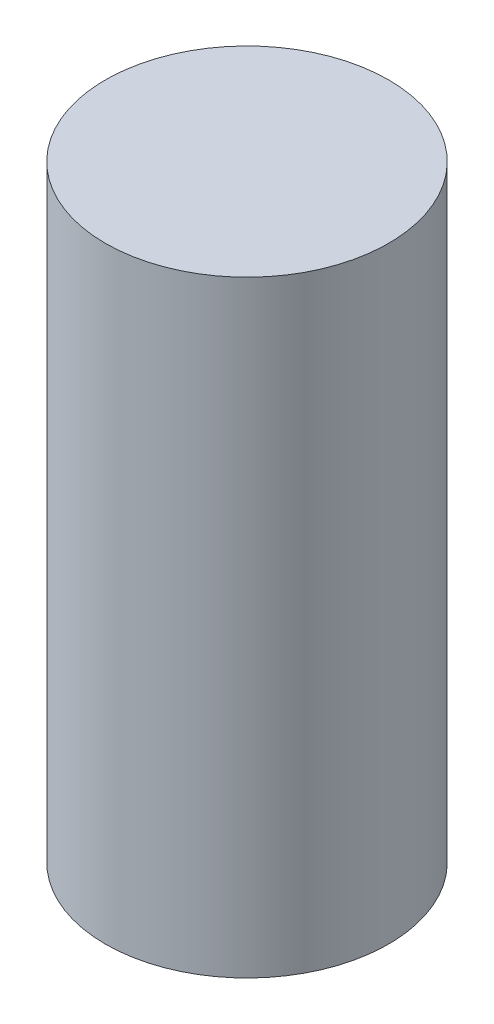
ISO-10303-21;
HEADER;
FILE_DESCRIPTION(('STEP AP214'),'2;1');
FILE_NAME('part.step','',(''),(''),'','','');
FILE_SCHEMA(('AUTOMOTIVE_DESIGN { 1 0 10303 214 1 1 1 1 }'));
ENDSEC;
DATA;
#1=APPLICATION_CONTEXT('core data for automotive mechanical design processes');
#2=APPLICATION_PROTOCOL_DEFINITION('international standard','automotive_design',2000,#1);
#3=PRODUCT_CONTEXT('',#1,'mechanical');
#4=PRODUCT('Part','Part','',(#3));
#5=PRODUCT_RELATED_PRODUCT_CATEGORY('part','',(#4));
#6=PRODUCT_DEFINITION_FORMATION('','',#4);
#7=PRODUCT_DEFINITION_CONTEXT('part definition',#1,'design');
#8=PRODUCT_DEFINITION('design','',#6,#7);
#9=PRODUCT_DEFINITION_SHAPE('','',#8);
#10=(LENGTH_UNIT() NAMED_UNIT(*) SI_UNIT(.MILLI.,.METRE.));
#11=(NAMED_UNIT(*) PLANE_ANGLE_UNIT() SI_UNIT($,.RADIAN.));
#12=(NAMED_UNIT(*) SI_UNIT($,.STERADIAN.) SOLID_ANGLE_UNIT());
#13=UNCERTAINTY_MEASURE_WITH_UNIT(LENGTH_MEASURE(1.E-05),#10,'distance_accuracy_value','');
#14=(GEOMETRIC_REPRESENTATION_CONTEXT(3) GLOBAL_UNCERTAINTY_ASSIGNED_CONTEXT((#13)) GLOBAL_UNIT_ASSIGNED_CONTEXT((#10,
#11,#12)) REPRESENTATION_CONTEXT('',''));
#15=CARTESIAN_POINT('',(0.,0.,0.));
#16=DIRECTION('',(0.,0.,1.));
#17=DIRECTION('',(1.,0.,0.));
#18=AXIS2_PLACEMENT_3D('',#15,#16,#17);
#19=CARTESIAN_POINT('',(0.,3.75,0.));
#20=DIRECTION('',(0.,-1.,0.));
#21=DIRECTION('',(0.,0.,-1.));
#22=AXIS2_PLACEMENT_3D('',#19,#20,#21);
#23=CYLINDRICAL_SURFACE('',#22,0.875);
#24=CARTESIAN_POINT('',(0.,3.75,0.));
#25=DIRECTION('',(0.,1.,0.));
#26=DIRECTION('',(0.,0.,1.));
#27=AXIS2_PLACEMENT_3D('',#24,#25,#26);
#28=CIRCLE('',#27,0.875);
#29=CARTESIAN_POINT('',(0.,3.75,0.875));
#30=VERTEX_POINT('',#29);
#31=EDGE_CURVE('E10',#30,#30,#28,.T.);
#32=ORIENTED_EDGE('',*,*,#31,.F.);
#33=EDGE_LOOP('',(#32));
#34=FACE_BOUND('',#33,.T.);
#35=CARTESIAN_POINT('',(0.,0.,0.));
#36=DIRECTION('',(0.,1.,0.));
#37=DIRECTION('',(0.,0.,1.));
#38=AXIS2_PLACEMENT_3D('',#35,#36,#37);
#39=CIRCLE('',#38,0.875);
#40=CARTESIAN_POINT('',(0.,0.,0.875));
#41=VERTEX_POINT('',#40);
#42=EDGE_CURVE('E38',#41,#41,#39,.T.);
#43=ORIENTED_EDGE('',*,*,#42,.T.);
#44=EDGE_LOOP('',(#43));
#45=FACE_BOUND('',#44,.T.);
#46=ADVANCED_FACE('F35',(#34,#45),#23,.T.);
#47=CARTESIAN_POINT('',(0.,3.75,0.));
#48=DIRECTION('',(0.,1.,0.));
#49=DIRECTION('',(0.,0.,1.));
#50=AXIS2_PLACEMENT_3D('',#47,#48,#49);
#51=PLANE('',#50);
#52=ORIENTED_EDGE('',*,*,#31,.T.);
#53=EDGE_LOOP('',(#52));
#54=FACE_BOUND('',#53,.T.);
#55=ADVANCED_FACE('F50',(#54),#51,.T.);
#56=CARTESIAN_POINT('',(0.,0.,0.));
#57=DIRECTION('',(0.,1.,0.));
#58=DIRECTION('',(0.,0.,1.));
#59=AXIS2_PLACEMENT_3D('',#56,#57,#58);
#60=PLANE('',#59);
#61=ORIENTED_EDGE('',*,*,#42,.F.);
#62=EDGE_LOOP('',(#61));
#63=FACE_BOUND('',#62,.T.);
#64=ADVANCED_FACE('F48',(#63),#60,.F.);
#65=CLOSED_SHELL('',(#46,#55,#64));
#66=MANIFOLD_SOLID_BREP('B2',#65);
#67=ADVANCED_BREP_SHAPE_REPRESENTATION('',(#18,#66),#14);
#68=SHAPE_DEFINITION_REPRESENTATION(#9,#67);
ENDSEC;
END-ISO-10303-21;
